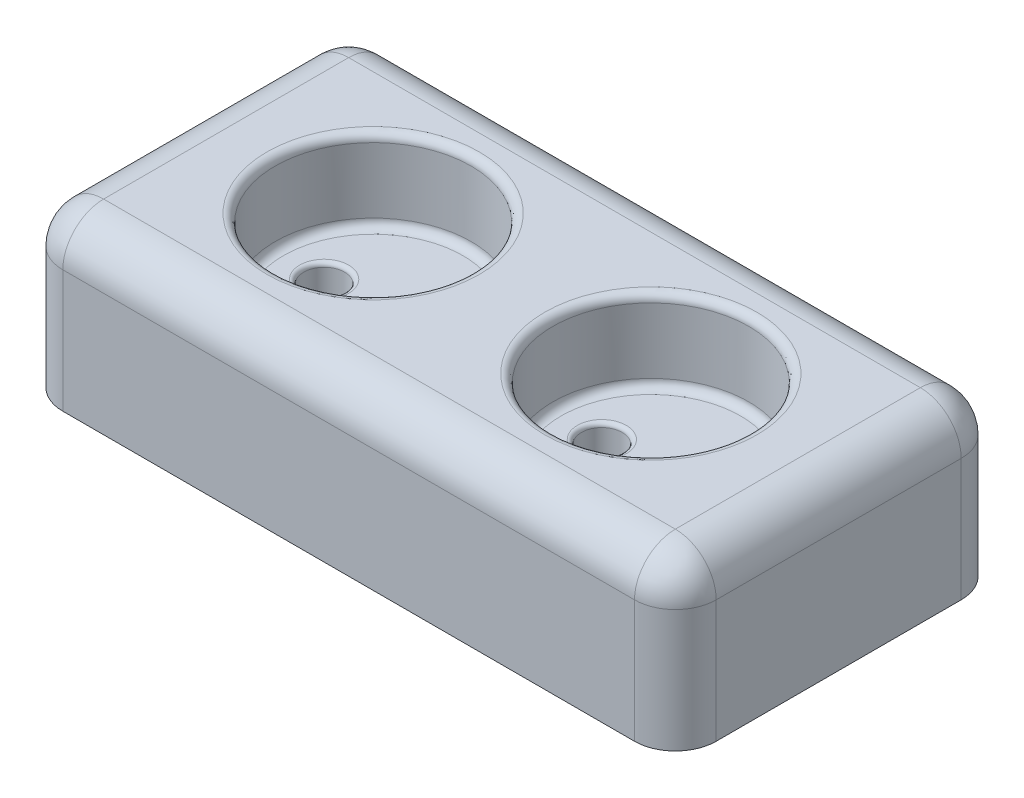
ISO-10303-21;
HEADER;
FILE_DESCRIPTION(('STEP AP214'),'2;1');
FILE_NAME('part.step','',(''),(''),'','','');
FILE_SCHEMA(('AUTOMOTIVE_DESIGN { 1 0 10303 214 1 1 1 1 }'));
ENDSEC;
DATA;
#1=APPLICATION_CONTEXT('core data for automotive mechanical design processes');
#2=APPLICATION_PROTOCOL_DEFINITION('international standard','automotive_design',2000,#1);
#3=PRODUCT_CONTEXT('',#1,'mechanical');
#4=PRODUCT('Part','Part','',(#3));
#5=PRODUCT_RELATED_PRODUCT_CATEGORY('part','',(#4));
#6=PRODUCT_DEFINITION_FORMATION('','',#4);
#7=PRODUCT_DEFINITION_CONTEXT('part definition',#1,'design');
#8=PRODUCT_DEFINITION('design','',#6,#7);
#9=PRODUCT_DEFINITION_SHAPE('','',#8);
#10=(LENGTH_UNIT() NAMED_UNIT(*) SI_UNIT(.MILLI.,.METRE.));
#11=(NAMED_UNIT(*) PLANE_ANGLE_UNIT() SI_UNIT($,.RADIAN.));
#12=(NAMED_UNIT(*) SI_UNIT($,.STERADIAN.) SOLID_ANGLE_UNIT());
#13=UNCERTAINTY_MEASURE_WITH_UNIT(LENGTH_MEASURE(1.E-05),#10,'distance_accuracy_value','');
#14=(GEOMETRIC_REPRESENTATION_CONTEXT(3) GLOBAL_UNCERTAINTY_ASSIGNED_CONTEXT((#13)) GLOBAL_UNIT_ASSIGNED_CONTEXT((#10,
#11,#12)) REPRESENTATION_CONTEXT('',''));
#15=CARTESIAN_POINT('',(0.,0.,0.));
#16=DIRECTION('',(0.,0.,1.));
#17=DIRECTION('',(1.,0.,0.));
#18=AXIS2_PLACEMENT_3D('',#15,#16,#17);
#19=CARTESIAN_POINT('',(-50.1993717043038,20.,29.1828883352771));
#20=DIRECTION('',(1.,0.,0.));
#21=DIRECTION('',(0.,0.,-1.));
#22=AXIS2_PLACEMENT_3D('',#19,#20,#21);
#23=PLANE('',#22);
#24=DIRECTION('',(0.,-1.,0.));
#25=VECTOR('',#24,1.);
#26=CARTESIAN_POINT('',(-50.1993717043038,20.,24.1828883352771));
#27=LINE('',#26,#25);
#28=CARTESIAN_POINT('',(-50.1993717043038,0.,24.1828883352771));
#29=VERTEX_POINT('',#28);
#30=CARTESIAN_POINT('',(-50.1993717043038,15.,24.1828883352771));
#31=VERTEX_POINT('',#30);
#32=EDGE_CURVE('E124',#29,#31,#27,.F.);
#33=ORIENTED_EDGE('',*,*,#32,.T.);
#34=DIRECTION('',(0.,0.,1.));
#35=VECTOR('',#34,1.);
#36=CARTESIAN_POINT('',(-50.1993717043038,15.,29.1828883352771));
#37=LINE('',#36,#35);
#38=CARTESIAN_POINT('',(-50.1993717043038,15.,-5.81711166472289));
#39=VERTEX_POINT('',#38);
#40=EDGE_CURVE('E122',#31,#39,#37,.F.);
#41=ORIENTED_EDGE('',*,*,#40,.T.);
#42=DIRECTION('',(0.,-1.,0.));
#43=VECTOR('',#42,1.);
#44=CARTESIAN_POINT('',(-50.1993717043038,20.,-5.81711166472289));
#45=LINE('',#44,#43);
#46=CARTESIAN_POINT('',(-50.1993717043038,0.,-5.81711166472289));
#47=VERTEX_POINT('',#46);
#48=EDGE_CURVE('E115',#39,#47,#45,.T.);
#49=ORIENTED_EDGE('',*,*,#48,.T.);
#50=DIRECTION('',(0.,0.,1.));
#51=VECTOR('',#50,1.);
#52=CARTESIAN_POINT('',(-50.1993717043038,0.,29.1828883352771));
#53=LINE('',#52,#51);
#54=EDGE_CURVE('E119',#47,#29,#53,.T.);
#55=ORIENTED_EDGE('',*,*,#54,.T.);
#56=EDGE_LOOP('',(#33,#41,#49,#55));
#57=FACE_BOUND('',#56,.T.);
#58=ADVANCED_FACE('F37',(#57),#23,.F.);
#59=CARTESIAN_POINT('',(-50.1993717043038,20.,29.1828883352771));
#60=DIRECTION('',(0.,0.,-1.));
#61=DIRECTION('',(-1.,0.,0.));
#62=AXIS2_PLACEMENT_3D('',#59,#60,#61);
#63=PLANE('',#62);
#64=DIRECTION('',(0.,-1.,0.));
#65=VECTOR('',#64,1.);
#66=CARTESIAN_POINT('',(24.8006282956962,20.,29.1828883352771));
#67=LINE('',#66,#65);
#68=CARTESIAN_POINT('',(24.8006282956962,0.,29.1828883352771));
#69=VERTEX_POINT('',#68);
#70=CARTESIAN_POINT('',(24.8006282956962,15.,29.1828883352771));
#71=VERTEX_POINT('',#70);
#72=EDGE_CURVE('E169',#69,#71,#67,.F.);
#73=ORIENTED_EDGE('',*,*,#72,.T.);
#74=DIRECTION('',(1.,0.,0.));
#75=VECTOR('',#74,1.);
#76=CARTESIAN_POINT('',(-50.1993717043038,15.,29.1828883352771));
#77=LINE('',#76,#75);
#78=CARTESIAN_POINT('',(-45.1993717043038,15.,29.1828883352771));
#79=VERTEX_POINT('',#78);
#80=EDGE_CURVE('E185',#71,#79,#77,.F.);
#81=ORIENTED_EDGE('',*,*,#80,.T.);
#82=DIRECTION('',(0.,-1.,0.));
#83=VECTOR('',#82,1.);
#84=CARTESIAN_POINT('',(-45.1993717043038,20.,29.1828883352771));
#85=LINE('',#84,#83);
#86=CARTESIAN_POINT('',(-45.1993717043038,0.,29.1828883352771));
#87=VERTEX_POINT('',#86);
#88=EDGE_CURVE('E167',#79,#87,#85,.T.);
#89=ORIENTED_EDGE('',*,*,#88,.T.);
#90=DIRECTION('',(1.,0.,0.));
#91=VECTOR('',#90,1.);
#92=CARTESIAN_POINT('',(-50.1993717043038,0.,29.1828883352771));
#93=LINE('',#92,#91);
#94=EDGE_CURVE('E138',#87,#69,#93,.T.);
#95=ORIENTED_EDGE('',*,*,#94,.T.);
#96=EDGE_LOOP('',(#73,#81,#89,#95));
#97=FACE_BOUND('',#96,.T.);
#98=ADVANCED_FACE('F303',(#97),#63,.F.);
#99=CARTESIAN_POINT('',(29.8006282956962,20.,29.1828883352771));
#100=DIRECTION('',(-1.,0.,0.));
#101=DIRECTION('',(0.,0.,1.));
#102=AXIS2_PLACEMENT_3D('',#99,#100,#101);
#103=PLANE('',#102);
#104=DIRECTION('',(0.,-1.,0.));
#105=VECTOR('',#104,1.);
#106=CARTESIAN_POINT('',(29.8006282956962,20.,-5.81711166472289));
#107=LINE('',#106,#105);
#108=CARTESIAN_POINT('',(29.8006282956962,0.,-5.81711166472289));
#109=VERTEX_POINT('',#108);
#110=CARTESIAN_POINT('',(29.8006282956962,15.,-5.81711166472289));
#111=VERTEX_POINT('',#110);
#112=EDGE_CURVE('E164',#109,#111,#107,.F.);
#113=ORIENTED_EDGE('',*,*,#112,.T.);
#114=DIRECTION('',(0.,0.,-1.));
#115=VECTOR('',#114,1.);
#116=CARTESIAN_POINT('',(29.8006282956962,15.,29.1828883352771));
#117=LINE('',#116,#115);
#118=CARTESIAN_POINT('',(29.8006282956962,15.,24.1828883352771));
#119=VERTEX_POINT('',#118);
#120=EDGE_CURVE('E189',#111,#119,#117,.F.);
#121=ORIENTED_EDGE('',*,*,#120,.T.);
#122=DIRECTION('',(0.,-1.,0.));
#123=VECTOR('',#122,1.);
#124=CARTESIAN_POINT('',(29.8006282956962,20.,24.1828883352771));
#125=LINE('',#124,#123);
#126=CARTESIAN_POINT('',(29.8006282956962,0.,24.1828883352771));
#127=VERTEX_POINT('',#126);
#128=EDGE_CURVE('E162',#119,#127,#125,.T.);
#129=ORIENTED_EDGE('',*,*,#128,.T.);
#130=DIRECTION('',(0.,0.,-1.));
#131=VECTOR('',#130,1.);
#132=CARTESIAN_POINT('',(29.8006282956962,0.,29.1828883352771));
#133=LINE('',#132,#131);
#134=EDGE_CURVE('E142',#127,#109,#133,.T.);
#135=ORIENTED_EDGE('',*,*,#134,.T.);
#136=EDGE_LOOP('',(#113,#121,#129,#135));
#137=FACE_BOUND('',#136,.T.);
#138=ADVANCED_FACE('F308',(#137),#103,.F.);
#139=CARTESIAN_POINT('',(-50.1993717043038,20.,-10.8171116647229));
#140=DIRECTION('',(0.,0.,1.));
#141=DIRECTION('',(1.,0.,0.));
#142=AXIS2_PLACEMENT_3D('',#139,#140,#141);
#143=PLANE('',#142);
#144=DIRECTION('',(0.,-1.,0.));
#145=VECTOR('',#144,1.);
#146=CARTESIAN_POINT('',(-45.1993717043038,20.,-10.8171116647229));
#147=LINE('',#146,#145);
#148=CARTESIAN_POINT('',(-45.1993717043038,0.,-10.8171116647229));
#149=VERTEX_POINT('',#148);
#150=CARTESIAN_POINT('',(-45.1993717043038,15.,-10.8171116647229));
#151=VERTEX_POINT('',#150);
#152=EDGE_CURVE('E128',#149,#151,#147,.F.);
#153=ORIENTED_EDGE('',*,*,#152,.T.);
#154=DIRECTION('',(-1.,0.,0.));
#155=VECTOR('',#154,1.);
#156=CARTESIAN_POINT('',(-50.1993717043038,15.,-10.8171116647229));
#157=LINE('',#156,#155);
#158=CARTESIAN_POINT('',(24.8006282956962,15.,-10.8171116647229));
#159=VERTEX_POINT('',#158);
#160=EDGE_CURVE('E52',#151,#159,#157,.F.);
#161=ORIENTED_EDGE('',*,*,#160,.T.);
#162=DIRECTION('',(0.,-1.,0.));
#163=VECTOR('',#162,1.);
#164=CARTESIAN_POINT('',(24.8006282956962,20.,-10.8171116647229));
#165=LINE('',#164,#163);
#166=CARTESIAN_POINT('',(24.8006282956962,0.,-10.8171116647229));
#167=VERTEX_POINT('',#166);
#168=EDGE_CURVE('E132',#159,#167,#165,.T.);
#169=ORIENTED_EDGE('',*,*,#168,.T.);
#170=DIRECTION('',(-1.,0.,0.));
#171=VECTOR('',#170,1.);
#172=CARTESIAN_POINT('',(-50.1993717043038,0.,-10.8171116647229));
#173=LINE('',#172,#171);
#174=EDGE_CURVE('E153',#167,#149,#173,.T.);
#175=ORIENTED_EDGE('',*,*,#174,.T.);
#176=EDGE_LOOP('',(#153,#161,#169,#175));
#177=FACE_BOUND('',#176,.T.);
#178=ADVANCED_FACE('F570',(#177),#143,.F.);
#179=CARTESIAN_POINT('',(0.,20.,0.));
#180=DIRECTION('',(0.,-1.,0.));
#181=DIRECTION('',(0.,0.,-1.));
#182=AXIS2_PLACEMENT_3D('',#179,#180,#181);
#183=PLANE('',#182);
#184=CARTESIAN_POINT('',(6.80062829569617,20.,9.18288833527713));
#185=DIRECTION('',(0.,-1.,0.));
#186=DIRECTION('',(0.,0.,-1.));
#187=AXIS2_PLACEMENT_3D('',#184,#185,#186);
#188=CIRCLE('',#187,13.);
#189=CARTESIAN_POINT('',(6.80062829569617,20.,-3.81711166472287));
#190=VERTEX_POINT('',#189);
#191=EDGE_CURVE('E229',#190,#190,#188,.T.);
#192=ORIENTED_EDGE('',*,*,#191,.T.);
#193=EDGE_LOOP('',(#192));
#194=FACE_BOUND('',#193,.T.);
#195=CARTESIAN_POINT('',(-27.1993717043038,20.,9.18288833527713));
#196=DIRECTION('',(0.,-1.,0.));
#197=DIRECTION('',(0.,0.,-1.));
#198=AXIS2_PLACEMENT_3D('',#195,#196,#197);
#199=CIRCLE('',#198,13.);
#200=CARTESIAN_POINT('',(-27.1993717043038,20.,-3.81711166472288));
#201=VERTEX_POINT('',#200);
#202=EDGE_CURVE('E226',#201,#201,#199,.T.);
#203=ORIENTED_EDGE('',*,*,#202,.T.);
#204=EDGE_LOOP('',(#203));
#205=FACE_BOUND('',#204,.T.);
#206=DIRECTION('',(-1.,0.,0.));
#207=VECTOR('',#206,1.);
#208=CARTESIAN_POINT('',(0.,20.,-5.81711166472289));
#209=LINE('',#208,#207);
#210=CARTESIAN_POINT('',(24.8006282956962,20.,-5.81711166472289));
#211=VERTEX_POINT('',#210);
#212=CARTESIAN_POINT('',(-45.1993717043038,20.,-5.81711166472289));
#213=VERTEX_POINT('',#212);
#214=EDGE_CURVE('E175',#211,#213,#209,.T.);
#215=ORIENTED_EDGE('',*,*,#214,.T.);
#216=DIRECTION('',(0.,0.,1.));
#217=VECTOR('',#216,1.);
#218=CARTESIAN_POINT('',(-45.1993717043038,20.,0.));
#219=LINE('',#218,#217);
#220=CARTESIAN_POINT('',(-45.1993717043038,20.,24.1828883352771));
#221=VERTEX_POINT('',#220);
#222=EDGE_CURVE('E181',#213,#221,#219,.T.);
#223=ORIENTED_EDGE('',*,*,#222,.T.);
#224=DIRECTION('',(1.,0.,0.));
#225=VECTOR('',#224,1.);
#226=CARTESIAN_POINT('',(0.,20.,24.1828883352771));
#227=LINE('',#226,#225);
#228=CARTESIAN_POINT('',(24.8006282956962,20.,24.1828883352771));
#229=VERTEX_POINT('',#228);
#230=EDGE_CURVE('E179',#221,#229,#227,.T.);
#231=ORIENTED_EDGE('',*,*,#230,.T.);
#232=DIRECTION('',(0.,0.,-1.));
#233=VECTOR('',#232,1.);
#234=CARTESIAN_POINT('',(24.8006282956962,20.,0.));
#235=LINE('',#234,#233);
#236=EDGE_CURVE('E177',#229,#211,#235,.T.);
#237=ORIENTED_EDGE('',*,*,#236,.T.);
#238=EDGE_LOOP('',(#215,#223,#231,#237));
#239=FACE_BOUND('',#238,.T.);
#240=ADVANCED_FACE('F562',(#194,#205,#239),#183,.F.);
#241=CARTESIAN_POINT('',(0.,0.,0.));
#242=DIRECTION('',(0.,-1.,0.));
#243=DIRECTION('',(0.,0.,-1.));
#244=AXIS2_PLACEMENT_3D('',#241,#242,#243);
#245=PLANE('',#244);
#246=CARTESIAN_POINT('',(-33.1993717043038,0.,9.18288833527713));
#247=DIRECTION('',(0.,1.,0.));
#248=DIRECTION('',(0.,0.,1.));
#249=AXIS2_PLACEMENT_3D('',#246,#247,#248);
#250=CIRCLE('',#249,2.5);
#251=CARTESIAN_POINT('',(-33.1993717043038,0.,11.6828883352771));
#252=VERTEX_POINT('',#251);
#253=EDGE_CURVE('E139',#252,#252,#250,.T.);
#254=ORIENTED_EDGE('',*,*,#253,.T.);
#255=EDGE_LOOP('',(#254));
#256=FACE_BOUND('',#255,.T.);
#257=CARTESIAN_POINT('',(-21.1993717043038,0.,9.18288833527713));
#258=DIRECTION('',(0.,1.,0.));
#259=DIRECTION('',(0.,0.,1.));
#260=AXIS2_PLACEMENT_3D('',#257,#258,#259);
#261=CIRCLE('',#260,2.5);
#262=CARTESIAN_POINT('',(-21.1993717043038,0.,11.6828883352771));
#263=VERTEX_POINT('',#262);
#264=EDGE_CURVE('E145',#263,#263,#261,.T.);
#265=ORIENTED_EDGE('',*,*,#264,.T.);
#266=EDGE_LOOP('',(#265));
#267=FACE_BOUND('',#266,.T.);
#268=CARTESIAN_POINT('',(0.80062829569617,0.,9.18288833527713));
#269=DIRECTION('',(0.,1.,0.));
#270=DIRECTION('',(0.,0.,1.));
#271=AXIS2_PLACEMENT_3D('',#268,#269,#270);
#272=CIRCLE('',#271,2.5);
#273=CARTESIAN_POINT('',(0.80062829569617,0.,11.6828883352771));
#274=VERTEX_POINT('',#273);
#275=EDGE_CURVE('E279',#274,#274,#272,.T.);
#276=ORIENTED_EDGE('',*,*,#275,.T.);
#277=EDGE_LOOP('',(#276));
#278=FACE_BOUND('',#277,.T.);
#279=CARTESIAN_POINT('',(12.8006282956962,0.,9.18288833527713));
#280=DIRECTION('',(0.,1.,0.));
#281=DIRECTION('',(0.,0.,1.));
#282=AXIS2_PLACEMENT_3D('',#279,#280,#281);
#283=CIRCLE('',#282,2.5);
#284=CARTESIAN_POINT('',(12.8006282956962,0.,11.6828883352771));
#285=VERTEX_POINT('',#284);
#286=EDGE_CURVE('E148',#285,#285,#283,.T.);
#287=ORIENTED_EDGE('',*,*,#286,.T.);
#288=EDGE_LOOP('',(#287));
#289=FACE_BOUND('',#288,.T.);
#290=ORIENTED_EDGE('',*,*,#54,.F.);
#291=CARTESIAN_POINT('',(-45.1993717043038,0.,-5.81711166472289));
#292=DIRECTION('',(0.,-1.,0.));
#293=DIRECTION('',(0.,0.,-1.));
#294=AXIS2_PLACEMENT_3D('',#291,#292,#293);
#295=CIRCLE('',#294,5.);
#296=EDGE_CURVE('E126',#47,#149,#295,.T.);
#297=ORIENTED_EDGE('',*,*,#296,.T.);
#298=ORIENTED_EDGE('',*,*,#174,.F.);
#299=CARTESIAN_POINT('',(24.8006282956962,0.,-5.81711166472289));
#300=DIRECTION('',(0.,-1.,0.));
#301=DIRECTION('',(0.,0.,-1.));
#302=AXIS2_PLACEMENT_3D('',#299,#300,#301);
#303=CIRCLE('',#302,5.);
#304=EDGE_CURVE('E133',#167,#109,#303,.T.);
#305=ORIENTED_EDGE('',*,*,#304,.T.);
#306=ORIENTED_EDGE('',*,*,#134,.F.);
#307=CARTESIAN_POINT('',(24.8006282956962,0.,24.1828883352771));
#308=DIRECTION('',(0.,-1.,0.));
#309=DIRECTION('',(0.,0.,-1.));
#310=AXIS2_PLACEMENT_3D('',#307,#308,#309);
#311=CIRCLE('',#310,5.);
#312=EDGE_CURVE('E157',#127,#69,#311,.T.);
#313=ORIENTED_EDGE('',*,*,#312,.T.);
#314=ORIENTED_EDGE('',*,*,#94,.F.);
#315=CARTESIAN_POINT('',(-45.1993717043038,0.,24.1828883352771));
#316=DIRECTION('',(0.,-1.,0.));
#317=DIRECTION('',(0.,0.,-1.));
#318=AXIS2_PLACEMENT_3D('',#315,#316,#317);
#319=CIRCLE('',#318,5.);
#320=EDGE_CURVE('E123',#87,#29,#319,.T.);
#321=ORIENTED_EDGE('',*,*,#320,.T.);
#322=EDGE_LOOP('',(#290,#297,#298,#305,#306,#313,#314,#321));
#323=FACE_BOUND('',#322,.T.);
#324=ADVANCED_FACE('F135',(#256,#267,#278,#289,#323),#245,.T.);
#325=CARTESIAN_POINT('',(-27.1993717043038,10.,9.18288833527713));
#326=DIRECTION('',(0.,1.,0.));
#327=DIRECTION('',(0.,0.,1.));
#328=AXIS2_PLACEMENT_3D('',#325,#326,#327);
#329=CYLINDRICAL_SURFACE('',#328,12.);
#330=CARTESIAN_POINT('',(-27.1993717043038,19.,9.18288833527713));
#331=DIRECTION('',(0.,-1.,0.));
#332=DIRECTION('',(0.,0.,-1.));
#333=AXIS2_PLACEMENT_3D('',#330,#331,#332);
#334=CIRCLE('',#333,12.);
#335=CARTESIAN_POINT('',(-27.1993717043038,19.,-2.81711166472288));
#336=VERTEX_POINT('',#335);
#337=EDGE_CURVE('E235',#336,#336,#334,.F.);
#338=ORIENTED_EDGE('',*,*,#337,.T.);
#339=EDGE_LOOP('',(#338));
#340=FACE_BOUND('',#339,.T.);
#341=CARTESIAN_POINT('',(-27.1993717043038,11.,9.18288833527713));
#342=DIRECTION('',(0.,1.,0.));
#343=DIRECTION('',(0.,0.,1.));
#344=AXIS2_PLACEMENT_3D('',#341,#342,#343);
#345=CIRCLE('',#344,12.);
#346=CARTESIAN_POINT('',(-27.1993717043038,11.,21.1828883352771));
#347=VERTEX_POINT('',#346);
#348=EDGE_CURVE('E232',#347,#347,#345,.F.);
#349=ORIENTED_EDGE('',*,*,#348,.T.);
#350=EDGE_LOOP('',(#349));
#351=FACE_BOUND('',#350,.T.);
#352=ADVANCED_FACE('F547',(#340,#351),#329,.F.);
#353=CARTESIAN_POINT('',(-27.1993717043038,10.,9.18288833527713));
#354=DIRECTION('',(0.,1.,0.));
#355=DIRECTION('',(0.,0.,1.));
#356=AXIS2_PLACEMENT_3D('',#353,#354,#355);
#357=PLANE('',#356);
#358=CARTESIAN_POINT('',(-21.1993717043038,10.,9.18288833527713));
#359=DIRECTION('',(0.,1.,0.));
#360=DIRECTION('',(0.,0.,1.));
#361=AXIS2_PLACEMENT_3D('',#358,#359,#360);
#362=CIRCLE('',#361,3.);
#363=CARTESIAN_POINT('',(-21.1993717043038,10.,12.1828883352771));
#364=VERTEX_POINT('',#363);
#365=EDGE_CURVE('E45',#364,#364,#362,.F.);
#366=ORIENTED_EDGE('',*,*,#365,.T.);
#367=EDGE_LOOP('',(#366));
#368=FACE_BOUND('',#367,.T.);
#369=CARTESIAN_POINT('',(-33.1993717043038,10.,9.18288833527713));
#370=DIRECTION('',(0.,1.,0.));
#371=DIRECTION('',(0.,0.,1.));
#372=AXIS2_PLACEMENT_3D('',#369,#370,#371);
#373=CIRCLE('',#372,3.);
#374=CARTESIAN_POINT('',(-33.1993717043038,10.,12.1828883352771));
#375=VERTEX_POINT('',#374);
#376=EDGE_CURVE('E256',#375,#375,#373,.F.);
#377=ORIENTED_EDGE('',*,*,#376,.T.);
#378=EDGE_LOOP('',(#377));
#379=FACE_BOUND('',#378,.T.);
#380=CARTESIAN_POINT('',(-27.1993717043038,10.,9.18288833527713));
#381=DIRECTION('',(0.,1.,0.));
#382=DIRECTION('',(0.,0.,1.));
#383=AXIS2_PLACEMENT_3D('',#380,#381,#382);
#384=CIRCLE('',#383,11.);
#385=CARTESIAN_POINT('',(-27.1993717043038,10.,20.1828883352771));
#386=VERTEX_POINT('',#385);
#387=EDGE_CURVE('E238',#386,#386,#384,.T.);
#388=ORIENTED_EDGE('',*,*,#387,.T.);
#389=EDGE_LOOP('',(#388));
#390=FACE_BOUND('',#389,.T.);
#391=ADVANCED_FACE('F261',(#368,#379,#390),#357,.T.);
#392=CARTESIAN_POINT('',(6.80062829569617,10.,9.18288833527713));
#393=DIRECTION('',(0.,1.,0.));
#394=DIRECTION('',(0.,0.,1.));
#395=AXIS2_PLACEMENT_3D('',#392,#393,#394);
#396=CYLINDRICAL_SURFACE('',#395,12.);
#397=CARTESIAN_POINT('',(6.80062829569617,11.,9.18288833527713));
#398=DIRECTION('',(0.,1.,0.));
#399=DIRECTION('',(0.,0.,1.));
#400=AXIS2_PLACEMENT_3D('',#397,#398,#399);
#401=CIRCLE('',#400,12.);
#402=CARTESIAN_POINT('',(6.80062829569617,11.,21.1828883352771));
#403=VERTEX_POINT('',#402);
#404=EDGE_CURVE('E223',#403,#403,#401,.F.);
#405=ORIENTED_EDGE('',*,*,#404,.T.);
#406=EDGE_LOOP('',(#405));
#407=FACE_BOUND('',#406,.T.);
#408=CARTESIAN_POINT('',(6.80062829569617,19.,9.18288833527713));
#409=DIRECTION('',(0.,-1.,0.));
#410=DIRECTION('',(0.,0.,-1.));
#411=AXIS2_PLACEMENT_3D('',#408,#409,#410);
#412=CIRCLE('',#411,12.);
#413=CARTESIAN_POINT('',(6.80062829569617,19.,-2.81711166472287));
#414=VERTEX_POINT('',#413);
#415=EDGE_CURVE('E220',#414,#414,#412,.F.);
#416=ORIENTED_EDGE('',*,*,#415,.T.);
#417=EDGE_LOOP('',(#416));
#418=FACE_BOUND('',#417,.T.);
#419=ADVANCED_FACE('F299',(#407,#418),#396,.F.);
#420=CARTESIAN_POINT('',(6.80062829569617,10.,9.18288833527713));
#421=DIRECTION('',(0.,1.,0.));
#422=DIRECTION('',(0.,0.,1.));
#423=AXIS2_PLACEMENT_3D('',#420,#421,#422);
#424=PLANE('',#423);
#425=CARTESIAN_POINT('',(12.8006282956962,10.,9.18288833527713));
#426=DIRECTION('',(0.,1.,0.));
#427=DIRECTION('',(0.,0.,1.));
#428=AXIS2_PLACEMENT_3D('',#425,#426,#427);
#429=CIRCLE('',#428,3.);
#430=CARTESIAN_POINT('',(12.8006282956962,10.,12.1828883352771));
#431=VERTEX_POINT('',#430);
#432=EDGE_CURVE('E247',#431,#431,#429,.F.);
#433=ORIENTED_EDGE('',*,*,#432,.T.);
#434=EDGE_LOOP('',(#433));
#435=FACE_BOUND('',#434,.T.);
#436=CARTESIAN_POINT('',(0.80062829569617,10.,9.18288833527713));
#437=DIRECTION('',(0.,1.,0.));
#438=DIRECTION('',(0.,0.,1.));
#439=AXIS2_PLACEMENT_3D('',#436,#437,#438);
#440=CIRCLE('',#439,3.);
#441=CARTESIAN_POINT('',(0.80062829569617,10.,12.1828883352771));
#442=VERTEX_POINT('',#441);
#443=EDGE_CURVE('E244',#442,#442,#440,.F.);
#444=ORIENTED_EDGE('',*,*,#443,.T.);
#445=EDGE_LOOP('',(#444));
#446=FACE_BOUND('',#445,.T.);
#447=CARTESIAN_POINT('',(6.80062829569617,10.,9.18288833527713));
#448=DIRECTION('',(0.,1.,0.));
#449=DIRECTION('',(0.,0.,1.));
#450=AXIS2_PLACEMENT_3D('',#447,#448,#449);
#451=CIRCLE('',#450,11.);
#452=CARTESIAN_POINT('',(6.80062829569617,10.,20.1828883352771));
#453=VERTEX_POINT('',#452);
#454=EDGE_CURVE('E195',#453,#453,#451,.T.);
#455=ORIENTED_EDGE('',*,*,#454,.T.);
#456=EDGE_LOOP('',(#455));
#457=FACE_BOUND('',#456,.T.);
#458=ADVANCED_FACE('F290',(#435,#446,#457),#424,.T.);
#459=CARTESIAN_POINT('',(12.8006282956962,0.,9.18288833527713));
#460=DIRECTION('',(0.,1.,0.));
#461=DIRECTION('',(0.,0.,1.));
#462=AXIS2_PLACEMENT_3D('',#459,#460,#461);
#463=CYLINDRICAL_SURFACE('',#462,2.5);
#464=CARTESIAN_POINT('',(12.8006282956962,9.5,9.18288833527713));
#465=DIRECTION('',(0.,1.,0.));
#466=DIRECTION('',(0.,0.,1.));
#467=AXIS2_PLACEMENT_3D('',#464,#465,#466);
#468=CIRCLE('',#467,2.5);
#469=CARTESIAN_POINT('',(12.8006282956962,9.5,11.6828883352771));
#470=VERTEX_POINT('',#469);
#471=EDGE_CURVE('E241',#470,#470,#468,.T.);
#472=ORIENTED_EDGE('',*,*,#471,.T.);
#473=EDGE_LOOP('',(#472));
#474=FACE_BOUND('',#473,.T.);
#475=ORIENTED_EDGE('',*,*,#286,.F.);
#476=EDGE_LOOP('',(#475));
#477=FACE_BOUND('',#476,.T.);
#478=ADVANCED_FACE('F288',(#474,#477),#463,.F.);
#479=CARTESIAN_POINT('',(0.80062829569617,0.,9.18288833527713));
#480=DIRECTION('',(0.,1.,0.));
#481=DIRECTION('',(0.,0.,1.));
#482=AXIS2_PLACEMENT_3D('',#479,#480,#481);
#483=CYLINDRICAL_SURFACE('',#482,2.5);
#484=CARTESIAN_POINT('',(0.80062829569617,9.5,9.18288833527713));
#485=DIRECTION('',(0.,1.,0.));
#486=DIRECTION('',(0.,0.,1.));
#487=AXIS2_PLACEMENT_3D('',#484,#485,#486);
#488=CIRCLE('',#487,2.5);
#489=CARTESIAN_POINT('',(0.80062829569617,9.5,11.6828883352771));
#490=VERTEX_POINT('',#489);
#491=EDGE_CURVE('E250',#490,#490,#488,.T.);
#492=ORIENTED_EDGE('',*,*,#491,.T.);
#493=EDGE_LOOP('',(#492));
#494=FACE_BOUND('',#493,.T.);
#495=ORIENTED_EDGE('',*,*,#275,.F.);
#496=EDGE_LOOP('',(#495));
#497=FACE_BOUND('',#496,.T.);
#498=ADVANCED_FACE('F274',(#494,#497),#483,.F.);
#499=CARTESIAN_POINT('',(-21.1993717043038,0.,9.18288833527713));
#500=DIRECTION('',(0.,1.,0.));
#501=DIRECTION('',(0.,0.,1.));
#502=AXIS2_PLACEMENT_3D('',#499,#500,#501);
#503=CYLINDRICAL_SURFACE('',#502,2.5);
#504=CARTESIAN_POINT('',(-21.1993717043038,9.5,9.18288833527713));
#505=DIRECTION('',(0.,1.,0.));
#506=DIRECTION('',(0.,0.,1.));
#507=AXIS2_PLACEMENT_3D('',#504,#505,#506);
#508=CIRCLE('',#507,2.5);
#509=CARTESIAN_POINT('',(-21.1993717043038,9.5,11.6828883352771));
#510=VERTEX_POINT('',#509);
#511=EDGE_CURVE('E253',#510,#510,#508,.T.);
#512=ORIENTED_EDGE('',*,*,#511,.T.);
#513=EDGE_LOOP('',(#512));
#514=FACE_BOUND('',#513,.T.);
#515=ORIENTED_EDGE('',*,*,#264,.F.);
#516=EDGE_LOOP('',(#515));
#517=FACE_BOUND('',#516,.T.);
#518=ADVANCED_FACE('F270',(#514,#517),#503,.F.);
#519=CARTESIAN_POINT('',(-33.1993717043038,0.,9.18288833527713));
#520=DIRECTION('',(0.,1.,0.));
#521=DIRECTION('',(0.,0.,1.));
#522=AXIS2_PLACEMENT_3D('',#519,#520,#521);
#523=CYLINDRICAL_SURFACE('',#522,2.5);
#524=CARTESIAN_POINT('',(-33.1993717043038,9.5,9.18288833527713));
#525=DIRECTION('',(0.,1.,0.));
#526=DIRECTION('',(0.,0.,1.));
#527=AXIS2_PLACEMENT_3D('',#524,#525,#526);
#528=CIRCLE('',#527,2.5);
#529=CARTESIAN_POINT('',(-33.1993717043038,9.5,11.6828883352771));
#530=VERTEX_POINT('',#529);
#531=EDGE_CURVE('E11',#530,#530,#528,.T.);
#532=ORIENTED_EDGE('',*,*,#531,.T.);
#533=EDGE_LOOP('',(#532));
#534=FACE_BOUND('',#533,.T.);
#535=ORIENTED_EDGE('',*,*,#253,.F.);
#536=EDGE_LOOP('',(#535));
#537=FACE_BOUND('',#536,.T.);
#538=ADVANCED_FACE('F273',(#534,#537),#523,.F.);
#539=CARTESIAN_POINT('',(-45.1993717043038,20.,-5.81711166472289));
#540=DIRECTION('',(0.,-1.,0.));
#541=DIRECTION('',(0.,0.,-1.));
#542=AXIS2_PLACEMENT_3D('',#539,#540,#541);
#543=CYLINDRICAL_SURFACE('',#542,5.);
#544=ORIENTED_EDGE('',*,*,#48,.F.);
#545=CARTESIAN_POINT('',(-45.1993717043038,15.,-5.81711166472289));
#546=DIRECTION('',(0.,-1.,0.));
#547=DIRECTION('',(0.,0.,-1.));
#548=AXIS2_PLACEMENT_3D('',#545,#546,#547);
#549=CIRCLE('',#548,5.);
#550=EDGE_CURVE('E60',#39,#151,#549,.T.);
#551=ORIENTED_EDGE('',*,*,#550,.T.);
#552=ORIENTED_EDGE('',*,*,#152,.F.);
#553=ORIENTED_EDGE('',*,*,#296,.F.);
#554=EDGE_LOOP('',(#544,#551,#552,#553));
#555=FACE_BOUND('',#554,.T.);
#556=ADVANCED_FACE('F127',(#555),#543,.T.);
#557=CARTESIAN_POINT('',(24.8006282956962,20.,-5.81711166472289));
#558=DIRECTION('',(0.,-1.,0.));
#559=DIRECTION('',(0.,0.,-1.));
#560=AXIS2_PLACEMENT_3D('',#557,#558,#559);
#561=CYLINDRICAL_SURFACE('',#560,5.);
#562=ORIENTED_EDGE('',*,*,#168,.F.);
#563=CARTESIAN_POINT('',(24.8006282956962,15.,-5.81711166472289));
#564=DIRECTION('',(0.,-1.,0.));
#565=DIRECTION('',(0.,0.,-1.));
#566=AXIS2_PLACEMENT_3D('',#563,#564,#565);
#567=CIRCLE('',#566,5.);
#568=EDGE_CURVE('E193',#159,#111,#567,.T.);
#569=ORIENTED_EDGE('',*,*,#568,.T.);
#570=ORIENTED_EDGE('',*,*,#112,.F.);
#571=ORIENTED_EDGE('',*,*,#304,.F.);
#572=EDGE_LOOP('',(#562,#569,#570,#571));
#573=FACE_BOUND('',#572,.T.);
#574=ADVANCED_FACE('F315',(#573),#561,.T.);
#575=CARTESIAN_POINT('',(24.8006282956962,20.,24.1828883352771));
#576=DIRECTION('',(0.,-1.,0.));
#577=DIRECTION('',(0.,0.,-1.));
#578=AXIS2_PLACEMENT_3D('',#575,#576,#577);
#579=CYLINDRICAL_SURFACE('',#578,5.);
#580=ORIENTED_EDGE('',*,*,#128,.F.);
#581=CARTESIAN_POINT('',(24.8006282956962,15.,24.1828883352771));
#582=DIRECTION('',(0.,-1.,0.));
#583=DIRECTION('',(0.,0.,-1.));
#584=AXIS2_PLACEMENT_3D('',#581,#582,#583);
#585=CIRCLE('',#584,5.);
#586=EDGE_CURVE('E187',#119,#71,#585,.T.);
#587=ORIENTED_EDGE('',*,*,#586,.T.);
#588=ORIENTED_EDGE('',*,*,#72,.F.);
#589=ORIENTED_EDGE('',*,*,#312,.F.);
#590=EDGE_LOOP('',(#580,#587,#588,#589));
#591=FACE_BOUND('',#590,.T.);
#592=ADVANCED_FACE('F318',(#591),#579,.T.);
#593=CARTESIAN_POINT('',(-45.1993717043038,20.,24.1828883352771));
#594=DIRECTION('',(0.,-1.,0.));
#595=DIRECTION('',(0.,0.,-1.));
#596=AXIS2_PLACEMENT_3D('',#593,#594,#595);
#597=CYLINDRICAL_SURFACE('',#596,5.);
#598=ORIENTED_EDGE('',*,*,#88,.F.);
#599=CARTESIAN_POINT('',(-45.1993717043038,15.,24.1828883352771));
#600=DIRECTION('',(0.,-1.,0.));
#601=DIRECTION('',(0.,0.,-1.));
#602=AXIS2_PLACEMENT_3D('',#599,#600,#601);
#603=CIRCLE('',#602,5.);
#604=EDGE_CURVE('E172',#79,#31,#603,.T.);
#605=ORIENTED_EDGE('',*,*,#604,.T.);
#606=ORIENTED_EDGE('',*,*,#32,.F.);
#607=ORIENTED_EDGE('',*,*,#320,.F.);
#608=EDGE_LOOP('',(#598,#605,#606,#607));
#609=FACE_BOUND('',#608,.T.);
#610=ADVANCED_FACE('F322',(#609),#597,.T.);
#611=CARTESIAN_POINT('',(24.8006282956962,15.,-5.81711166472289));
#612=DIRECTION('',(0.,-1.,0.));
#613=DIRECTION('',(0.,0.,-1.));
#614=AXIS2_PLACEMENT_3D('',#611,#612,#613);
#615=SPHERICAL_SURFACE('',#614,5.);
#616=CARTESIAN_POINT('',(24.8006282956962,15.,-5.81711166472289));
#617=DIRECTION('',(0.,0.,1.));
#618=DIRECTION('',(1.,0.,0.));
#619=AXIS2_PLACEMENT_3D('',#616,#617,#618);
#620=CIRCLE('',#619,5.);
#621=EDGE_CURVE('E212',#111,#211,#620,.T.);
#622=ORIENTED_EDGE('',*,*,#621,.F.);
#623=ORIENTED_EDGE('',*,*,#568,.F.);
#624=CARTESIAN_POINT('',(24.8006282956962,15.,-5.81711166472289));
#625=DIRECTION('',(-1.,0.,0.));
#626=DIRECTION('',(0.,0.,1.));
#627=AXIS2_PLACEMENT_3D('',#624,#625,#626);
#628=CIRCLE('',#627,5.);
#629=EDGE_CURVE('E215',#211,#159,#628,.T.);
#630=ORIENTED_EDGE('',*,*,#629,.F.);
#631=EDGE_LOOP('',(#622,#623,#630));
#632=FACE_BOUND('',#631,.T.);
#633=ADVANCED_FACE('F326',(#632),#615,.T.);
#634=CARTESIAN_POINT('',(0.,15.,-5.81711166472289));
#635=DIRECTION('',(-1.,0.,0.));
#636=DIRECTION('',(0.,0.,1.));
#637=AXIS2_PLACEMENT_3D('',#634,#635,#636);
#638=CYLINDRICAL_SURFACE('',#637,5.);
#639=ORIENTED_EDGE('',*,*,#629,.T.);
#640=ORIENTED_EDGE('',*,*,#160,.F.);
#641=CARTESIAN_POINT('',(-45.1993717043038,15.,-5.81711166472289));
#642=DIRECTION('',(-1.,0.,0.));
#643=DIRECTION('',(0.,0.,1.));
#644=AXIS2_PLACEMENT_3D('',#641,#642,#643);
#645=CIRCLE('',#644,5.);
#646=EDGE_CURVE('E209',#213,#151,#645,.T.);
#647=ORIENTED_EDGE('',*,*,#646,.F.);
#648=ORIENTED_EDGE('',*,*,#214,.F.);
#649=EDGE_LOOP('',(#639,#640,#647,#648));
#650=FACE_BOUND('',#649,.T.);
#651=ADVANCED_FACE('F352',(#650),#638,.T.);
#652=CARTESIAN_POINT('',(24.8006282956962,15.,0.));
#653=DIRECTION('',(0.,0.,-1.));
#654=DIRECTION('',(-1.,0.,0.));
#655=AXIS2_PLACEMENT_3D('',#652,#653,#654);
#656=CYLINDRICAL_SURFACE('',#655,5.);
#657=ORIENTED_EDGE('',*,*,#621,.T.);
#658=ORIENTED_EDGE('',*,*,#236,.F.);
#659=CARTESIAN_POINT('',(24.8006282956962,15.,24.1828883352771));
#660=DIRECTION('',(0.,0.,1.));
#661=DIRECTION('',(1.,0.,0.));
#662=AXIS2_PLACEMENT_3D('',#659,#660,#661);
#663=CIRCLE('',#662,5.);
#664=EDGE_CURVE('E206',#119,#229,#663,.T.);
#665=ORIENTED_EDGE('',*,*,#664,.F.);
#666=ORIENTED_EDGE('',*,*,#120,.F.);
#667=EDGE_LOOP('',(#657,#658,#665,#666));
#668=FACE_BOUND('',#667,.T.);
#669=ADVANCED_FACE('F348',(#668),#656,.T.);
#670=CARTESIAN_POINT('',(-45.1993717043038,15.,-5.81711166472289));
#671=DIRECTION('',(0.,-1.,0.));
#672=DIRECTION('',(0.,0.,-1.));
#673=AXIS2_PLACEMENT_3D('',#670,#671,#672);
#674=SPHERICAL_SURFACE('',#673,5.);
#675=ORIENTED_EDGE('',*,*,#646,.T.);
#676=ORIENTED_EDGE('',*,*,#550,.F.);
#677=CARTESIAN_POINT('',(-45.1993717043038,15.,-5.81711166472289));
#678=DIRECTION('',(0.,0.,1.));
#679=DIRECTION('',(1.,0.,0.));
#680=AXIS2_PLACEMENT_3D('',#677,#678,#679);
#681=CIRCLE('',#680,5.);
#682=EDGE_CURVE('E203',#213,#39,#681,.T.);
#683=ORIENTED_EDGE('',*,*,#682,.F.);
#684=EDGE_LOOP('',(#675,#676,#683));
#685=FACE_BOUND('',#684,.T.);
#686=ADVANCED_FACE('F344',(#685),#674,.T.);
#687=CARTESIAN_POINT('',(24.8006282956962,15.,24.1828883352771));
#688=DIRECTION('',(0.,-1.,0.));
#689=DIRECTION('',(0.,0.,-1.));
#690=AXIS2_PLACEMENT_3D('',#687,#688,#689);
#691=SPHERICAL_SURFACE('',#690,5.);
#692=ORIENTED_EDGE('',*,*,#586,.F.);
#693=ORIENTED_EDGE('',*,*,#664,.T.);
#694=CARTESIAN_POINT('',(24.8006282956962,15.,24.1828883352771));
#695=DIRECTION('',(-1.,0.,0.));
#696=DIRECTION('',(0.,0.,1.));
#697=AXIS2_PLACEMENT_3D('',#694,#695,#696);
#698=CIRCLE('',#697,5.);
#699=EDGE_CURVE('E200',#71,#229,#698,.T.);
#700=ORIENTED_EDGE('',*,*,#699,.F.);
#701=EDGE_LOOP('',(#692,#693,#700));
#702=FACE_BOUND('',#701,.T.);
#703=ADVANCED_FACE('F340',(#702),#691,.T.);
#704=CARTESIAN_POINT('',(-45.1993717043038,15.,0.));
#705=DIRECTION('',(0.,0.,1.));
#706=DIRECTION('',(1.,0.,0.));
#707=AXIS2_PLACEMENT_3D('',#704,#705,#706);
#708=CYLINDRICAL_SURFACE('',#707,5.);
#709=ORIENTED_EDGE('',*,*,#682,.T.);
#710=ORIENTED_EDGE('',*,*,#40,.F.);
#711=CARTESIAN_POINT('',(-45.1993717043038,15.,24.1828883352771));
#712=DIRECTION('',(0.,0.,1.));
#713=DIRECTION('',(1.,0.,0.));
#714=AXIS2_PLACEMENT_3D('',#711,#712,#713);
#715=CIRCLE('',#714,5.);
#716=EDGE_CURVE('E198',#221,#31,#715,.T.);
#717=ORIENTED_EDGE('',*,*,#716,.F.);
#718=ORIENTED_EDGE('',*,*,#222,.F.);
#719=EDGE_LOOP('',(#709,#710,#717,#718));
#720=FACE_BOUND('',#719,.T.);
#721=ADVANCED_FACE('F336',(#720),#708,.T.);
#722=CARTESIAN_POINT('',(0.,15.,24.1828883352771));
#723=DIRECTION('',(1.,0.,0.));
#724=DIRECTION('',(0.,0.,-1.));
#725=AXIS2_PLACEMENT_3D('',#722,#723,#724);
#726=CYLINDRICAL_SURFACE('',#725,5.);
#727=ORIENTED_EDGE('',*,*,#699,.T.);
#728=ORIENTED_EDGE('',*,*,#230,.F.);
#729=CARTESIAN_POINT('',(-45.1993717043038,15.,24.1828883352771));
#730=DIRECTION('',(-1.,0.,0.));
#731=DIRECTION('',(0.,0.,1.));
#732=AXIS2_PLACEMENT_3D('',#729,#730,#731);
#733=CIRCLE('',#732,5.);
#734=EDGE_CURVE('E196',#79,#221,#733,.T.);
#735=ORIENTED_EDGE('',*,*,#734,.F.);
#736=ORIENTED_EDGE('',*,*,#80,.F.);
#737=EDGE_LOOP('',(#727,#728,#735,#736));
#738=FACE_BOUND('',#737,.T.);
#739=ADVANCED_FACE('F332',(#738),#726,.T.);
#740=CARTESIAN_POINT('',(-45.1993717043038,15.,24.1828883352771));
#741=DIRECTION('',(0.,-1.,0.));
#742=DIRECTION('',(0.,0.,-1.));
#743=AXIS2_PLACEMENT_3D('',#740,#741,#742);
#744=SPHERICAL_SURFACE('',#743,5.);
#745=ORIENTED_EDGE('',*,*,#716,.T.);
#746=ORIENTED_EDGE('',*,*,#604,.F.);
#747=ORIENTED_EDGE('',*,*,#734,.T.);
#748=EDGE_LOOP('',(#745,#746,#747));
#749=FACE_BOUND('',#748,.T.);
#750=ADVANCED_FACE('F328',(#749),#744,.T.);
#751=CARTESIAN_POINT('',(6.80062829569617,11.,9.18288833527713));
#752=DIRECTION('',(0.,1.,0.));
#753=DIRECTION('',(0.,0.,1.));
#754=AXIS2_PLACEMENT_3D('',#751,#752,#753);
#755=TOROIDAL_SURFACE('',#754,11.,1.);
#756=ORIENTED_EDGE('',*,*,#404,.F.);
#757=EDGE_LOOP('',(#756));
#758=FACE_BOUND('',#757,.T.);
#759=ORIENTED_EDGE('',*,*,#454,.F.);
#760=EDGE_LOOP('',(#759));
#761=FACE_BOUND('',#760,.T.);
#762=ADVANCED_FACE('F331',(#758,#761),#755,.F.);
#763=CARTESIAN_POINT('',(6.80062829569617,19.,9.18288833527713));
#764=DIRECTION('',(0.,-1.,0.));
#765=DIRECTION('',(0.,0.,-1.));
#766=AXIS2_PLACEMENT_3D('',#763,#764,#765);
#767=TOROIDAL_SURFACE('',#766,13.,1.);
#768=ORIENTED_EDGE('',*,*,#191,.F.);
#769=EDGE_LOOP('',(#768));
#770=FACE_BOUND('',#769,.T.);
#771=ORIENTED_EDGE('',*,*,#415,.F.);
#772=EDGE_LOOP('',(#771));
#773=FACE_BOUND('',#772,.T.);
#774=ADVANCED_FACE('F362',(#770,#773),#767,.T.);
#775=CARTESIAN_POINT('',(-27.1993717043038,19.,9.18288833527713));
#776=DIRECTION('',(0.,-1.,0.));
#777=DIRECTION('',(0.,0.,-1.));
#778=AXIS2_PLACEMENT_3D('',#775,#776,#777);
#779=TOROIDAL_SURFACE('',#778,13.,1.);
#780=ORIENTED_EDGE('',*,*,#202,.F.);
#781=EDGE_LOOP('',(#780));
#782=FACE_BOUND('',#781,.T.);
#783=ORIENTED_EDGE('',*,*,#337,.F.);
#784=EDGE_LOOP('',(#783));
#785=FACE_BOUND('',#784,.T.);
#786=ADVANCED_FACE('F366',(#782,#785),#779,.T.);
#787=CARTESIAN_POINT('',(-27.1993717043038,11.,9.18288833527713));
#788=DIRECTION('',(0.,1.,0.));
#789=DIRECTION('',(0.,0.,1.));
#790=AXIS2_PLACEMENT_3D('',#787,#788,#789);
#791=TOROIDAL_SURFACE('',#790,11.,1.);
#792=ORIENTED_EDGE('',*,*,#348,.F.);
#793=EDGE_LOOP('',(#792));
#794=FACE_BOUND('',#793,.T.);
#795=ORIENTED_EDGE('',*,*,#387,.F.);
#796=EDGE_LOOP('',(#795));
#797=FACE_BOUND('',#796,.T.);
#798=ADVANCED_FACE('F370',(#794,#797),#791,.F.);
#799=CARTESIAN_POINT('',(12.8006282956962,9.5,9.18288833527713));
#800=DIRECTION('',(0.,1.,0.));
#801=DIRECTION('',(0.,0.,1.));
#802=AXIS2_PLACEMENT_3D('',#799,#800,#801);
#803=TOROIDAL_SURFACE('',#802,3.,0.5);
#804=ORIENTED_EDGE('',*,*,#432,.F.);
#805=EDGE_LOOP('',(#804));
#806=FACE_BOUND('',#805,.T.);
#807=ORIENTED_EDGE('',*,*,#471,.F.);
#808=EDGE_LOOP('',(#807));
#809=FACE_BOUND('',#808,.T.);
#810=ADVANCED_FACE('F374',(#806,#809),#803,.T.);
#811=CARTESIAN_POINT('',(0.80062829569617,9.5,9.18288833527713));
#812=DIRECTION('',(0.,1.,0.));
#813=DIRECTION('',(0.,0.,1.));
#814=AXIS2_PLACEMENT_3D('',#811,#812,#813);
#815=TOROIDAL_SURFACE('',#814,3.,0.5);
#816=ORIENTED_EDGE('',*,*,#443,.F.);
#817=EDGE_LOOP('',(#816));
#818=FACE_BOUND('',#817,.T.);
#819=ORIENTED_EDGE('',*,*,#491,.F.);
#820=EDGE_LOOP('',(#819));
#821=FACE_BOUND('',#820,.T.);
#822=ADVANCED_FACE('F267',(#818,#821),#815,.T.);
#823=CARTESIAN_POINT('',(-21.1993717043038,9.5,9.18288833527713));
#824=DIRECTION('',(0.,1.,0.));
#825=DIRECTION('',(0.,0.,1.));
#826=AXIS2_PLACEMENT_3D('',#823,#824,#825);
#827=TOROIDAL_SURFACE('',#826,3.,0.5);
#828=ORIENTED_EDGE('',*,*,#365,.F.);
#829=EDGE_LOOP('',(#828));
#830=FACE_BOUND('',#829,.T.);
#831=ORIENTED_EDGE('',*,*,#511,.F.);
#832=EDGE_LOOP('',(#831));
#833=FACE_BOUND('',#832,.T.);
#834=ADVANCED_FACE('F264',(#830,#833),#827,.T.);
#835=CARTESIAN_POINT('',(-33.1993717043038,9.5,9.18288833527713));
#836=DIRECTION('',(0.,1.,0.));
#837=DIRECTION('',(0.,0.,1.));
#838=AXIS2_PLACEMENT_3D('',#835,#836,#837);
#839=TOROIDAL_SURFACE('',#838,3.,0.5);
#840=ORIENTED_EDGE('',*,*,#376,.F.);
#841=EDGE_LOOP('',(#840));
#842=FACE_BOUND('',#841,.T.);
#843=ORIENTED_EDGE('',*,*,#531,.F.);
#844=EDGE_LOOP('',(#843));
#845=FACE_BOUND('',#844,.T.);
#846=ADVANCED_FACE('F39',(#842,#845),#839,.T.);
#847=CLOSED_SHELL('',(#58,#98,#138,#178,#240,#324,#352,#391,#419,#458,#478,#498,#518,#538,#556,
#574,#592,#610,#633,#651,#669,#686,#703,#721,#739,#750,#762,#774,#786,#798,#810,#822,#834,#846));
#848=MANIFOLD_SOLID_BREP('B2',#847);
#849=ADVANCED_BREP_SHAPE_REPRESENTATION('',(#18,#848),#14);
#850=SHAPE_DEFINITION_REPRESENTATION(#9,#849);
ENDSEC;
END-ISO-10303-21;
